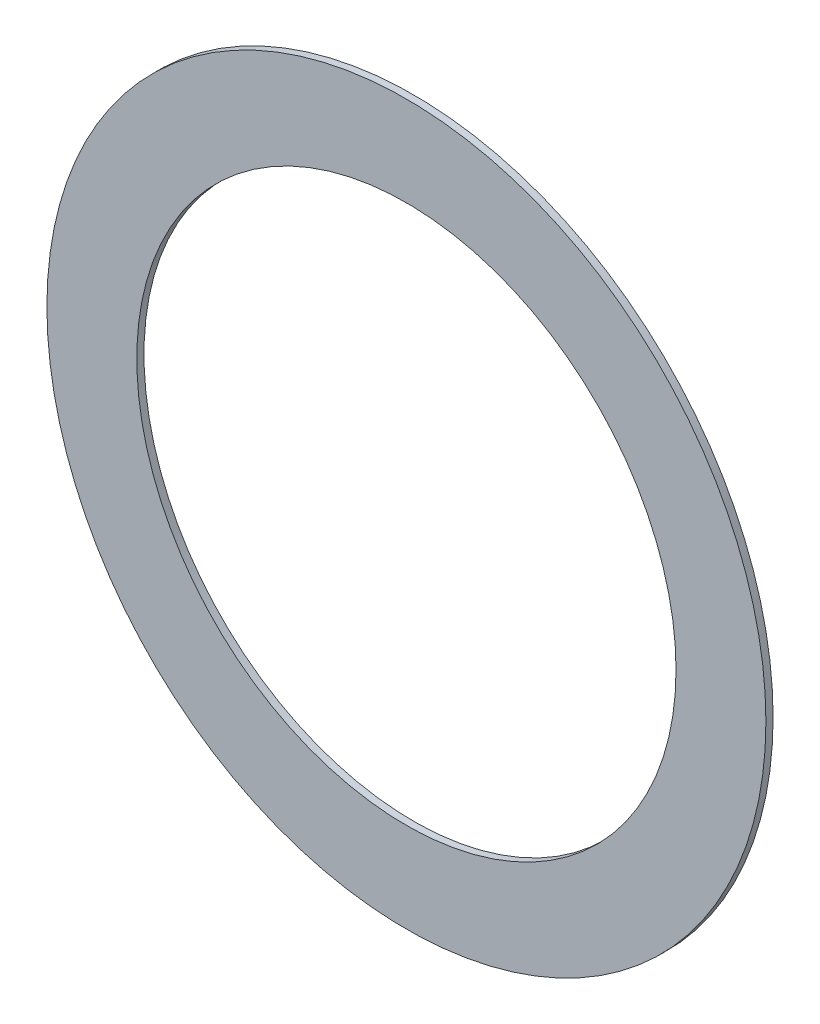
ISO-10303-21;
HEADER;
FILE_DESCRIPTION(('STEP AP214'),'2;1');
FILE_NAME('part.step','',(''),(''),'','','');
FILE_SCHEMA(('AUTOMOTIVE_DESIGN { 1 0 10303 214 1 1 1 1 }'));
ENDSEC;
DATA;
#1=APPLICATION_CONTEXT('core data for automotive mechanical design processes');
#2=APPLICATION_PROTOCOL_DEFINITION('international standard','automotive_design',2000,#1);
#3=PRODUCT_CONTEXT('',#1,'mechanical');
#4=PRODUCT('Part','Part','',(#3));
#5=PRODUCT_RELATED_PRODUCT_CATEGORY('part','',(#4));
#6=PRODUCT_DEFINITION_FORMATION('','',#4);
#7=PRODUCT_DEFINITION_CONTEXT('part definition',#1,'design');
#8=PRODUCT_DEFINITION('design','',#6,#7);
#9=PRODUCT_DEFINITION_SHAPE('','',#8);
#10=(LENGTH_UNIT() NAMED_UNIT(*) SI_UNIT(.MILLI.,.METRE.));
#11=(NAMED_UNIT(*) PLANE_ANGLE_UNIT() SI_UNIT($,.RADIAN.));
#12=(NAMED_UNIT(*) SI_UNIT($,.STERADIAN.) SOLID_ANGLE_UNIT());
#13=UNCERTAINTY_MEASURE_WITH_UNIT(LENGTH_MEASURE(1.E-05),#10,'distance_accuracy_value','');
#14=(GEOMETRIC_REPRESENTATION_CONTEXT(3) GLOBAL_UNCERTAINTY_ASSIGNED_CONTEXT((#13)) GLOBAL_UNIT_ASSIGNED_CONTEXT((#10,
#11,#12)) REPRESENTATION_CONTEXT('',''));
#15=CARTESIAN_POINT('',(0.,0.,0.));
#16=DIRECTION('',(0.,0.,1.));
#17=DIRECTION('',(1.,0.,0.));
#18=AXIS2_PLACEMENT_3D('',#15,#16,#17);
#19=CARTESIAN_POINT('',(0.,0.,1.));
#20=DIRECTION('',(0.,0.,1.));
#21=DIRECTION('',(1.,0.,0.));
#22=AXIS2_PLACEMENT_3D('',#19,#20,#21);
#23=PLANE('',#22);
#24=CARTESIAN_POINT('',(0.,0.,1.));
#25=DIRECTION('',(0.,0.,1.));
#26=DIRECTION('',(1.,0.,0.));
#27=AXIS2_PLACEMENT_3D('',#24,#25,#26);
#28=CIRCLE('',#27,50.);
#29=CARTESIAN_POINT('',(50.,0.,1.));
#30=VERTEX_POINT('',#29);
#31=EDGE_CURVE('E10',#30,#30,#28,.T.);
#32=ORIENTED_EDGE('',*,*,#31,.T.);
#33=EDGE_LOOP('',(#32));
#34=FACE_BOUND('',#33,.T.);
#35=CARTESIAN_POINT('',(0.,0.,1.));
#36=DIRECTION('',(0.,0.,1.));
#37=DIRECTION('',(1.,0.,0.));
#38=AXIS2_PLACEMENT_3D('',#35,#36,#37);
#39=CIRCLE('',#38,37.5);
#40=CARTESIAN_POINT('',(37.5,0.,1.));
#41=VERTEX_POINT('',#40);
#42=EDGE_CURVE('E46',#41,#41,#39,.T.);
#43=ORIENTED_EDGE('',*,*,#42,.F.);
#44=EDGE_LOOP('',(#43));
#45=FACE_BOUND('',#44,.T.);
#46=ADVANCED_FACE('F35',(#34,#45),#23,.T.);
#47=CARTESIAN_POINT('',(0.,0.,0.));
#48=DIRECTION('',(0.,0.,1.));
#49=DIRECTION('',(1.,0.,0.));
#50=AXIS2_PLACEMENT_3D('',#47,#48,#49);
#51=PLANE('',#50);
#52=CARTESIAN_POINT('',(0.,0.,0.));
#53=DIRECTION('',(0.,0.,1.));
#54=DIRECTION('',(1.,0.,0.));
#55=AXIS2_PLACEMENT_3D('',#52,#53,#54);
#56=CIRCLE('',#55,50.);
#57=CARTESIAN_POINT('',(50.,0.,0.));
#58=VERTEX_POINT('',#57);
#59=EDGE_CURVE('E39',#58,#58,#56,.T.);
#60=ORIENTED_EDGE('',*,*,#59,.F.);
#61=EDGE_LOOP('',(#60));
#62=FACE_BOUND('',#61,.T.);
#63=CARTESIAN_POINT('',(0.,0.,0.));
#64=DIRECTION('',(0.,0.,1.));
#65=DIRECTION('',(1.,0.,0.));
#66=AXIS2_PLACEMENT_3D('',#63,#64,#65);
#67=CIRCLE('',#66,37.5);
#68=CARTESIAN_POINT('',(37.5,0.,0.));
#69=VERTEX_POINT('',#68);
#70=EDGE_CURVE('E48',#69,#69,#67,.T.);
#71=ORIENTED_EDGE('',*,*,#70,.T.);
#72=EDGE_LOOP('',(#71));
#73=FACE_BOUND('',#72,.T.);
#74=ADVANCED_FACE('F58',(#62,#73),#51,.F.);
#75=CARTESIAN_POINT('',(0.,0.,1.));
#76=DIRECTION('',(0.,0.,-1.));
#77=DIRECTION('',(-1.,0.,0.));
#78=AXIS2_PLACEMENT_3D('',#75,#76,#77);
#79=CYLINDRICAL_SURFACE('',#78,50.);
#80=ORIENTED_EDGE('',*,*,#31,.F.);
#81=EDGE_LOOP('',(#80));
#82=FACE_BOUND('',#81,.T.);
#83=ORIENTED_EDGE('',*,*,#59,.T.);
#84=EDGE_LOOP('',(#83));
#85=FACE_BOUND('',#84,.T.);
#86=ADVANCED_FACE('F37',(#82,#85),#79,.T.);
#87=CARTESIAN_POINT('',(0.,0.,1.));
#88=DIRECTION('',(0.,0.,-1.));
#89=DIRECTION('',(-1.,0.,0.));
#90=AXIS2_PLACEMENT_3D('',#87,#88,#89);
#91=CYLINDRICAL_SURFACE('',#90,37.5);
#92=ORIENTED_EDGE('',*,*,#42,.T.);
#93=EDGE_LOOP('',(#92));
#94=FACE_BOUND('',#93,.T.);
#95=ORIENTED_EDGE('',*,*,#70,.F.);
#96=EDGE_LOOP('',(#95));
#97=FACE_BOUND('',#96,.T.);
#98=ADVANCED_FACE('F54',(#94,#97),#91,.F.);
#99=CLOSED_SHELL('',(#46,#74,#86,#98));
#100=MANIFOLD_SOLID_BREP('B2',#99);
#101=ADVANCED_BREP_SHAPE_REPRESENTATION('',(#18,#100),#14);
#102=SHAPE_DEFINITION_REPRESENTATION(#9,#101);
ENDSEC;
END-ISO-10303-21;
